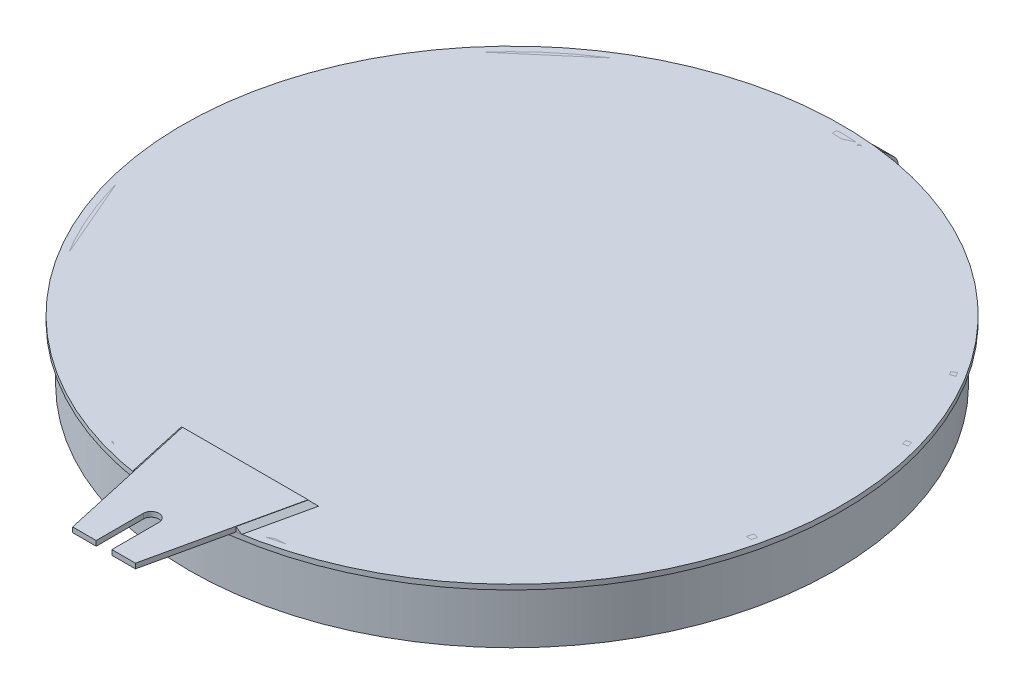
ISO-10303-21;
HEADER;
FILE_DESCRIPTION(('STEP AP214'),'2;1');
FILE_NAME('part.step','',(''),(''),'','','');
FILE_SCHEMA(('AUTOMOTIVE_DESIGN { 1 0 10303 214 1 1 1 1 }'));
ENDSEC;
DATA;
#1=APPLICATION_CONTEXT('core data for automotive mechanical design processes');
#2=APPLICATION_PROTOCOL_DEFINITION('international standard','automotive_design',2000,#1);
#3=PRODUCT_CONTEXT('',#1,'mechanical');
#4=PRODUCT('Part','Part','',(#3));
#5=PRODUCT_RELATED_PRODUCT_CATEGORY('part','',(#4));
#6=PRODUCT_DEFINITION_FORMATION('','',#4);
#7=PRODUCT_DEFINITION_CONTEXT('part definition',#1,'design');
#8=PRODUCT_DEFINITION('design','',#6,#7);
#9=PRODUCT_DEFINITION_SHAPE('','',#8);
#10=(LENGTH_UNIT() NAMED_UNIT(*) SI_UNIT(.MILLI.,.METRE.));
#11=(NAMED_UNIT(*) PLANE_ANGLE_UNIT() SI_UNIT($,.RADIAN.));
#12=(NAMED_UNIT(*) SI_UNIT($,.STERADIAN.) SOLID_ANGLE_UNIT());
#13=UNCERTAINTY_MEASURE_WITH_UNIT(LENGTH_MEASURE(1.E-05),#10,'distance_accuracy_value','');
#14=(GEOMETRIC_REPRESENTATION_CONTEXT(3) GLOBAL_UNCERTAINTY_ASSIGNED_CONTEXT((#13)) GLOBAL_UNIT_ASSIGNED_CONTEXT((#10,
#11,#12)) REPRESENTATION_CONTEXT('',''));
#15=CARTESIAN_POINT('',(0.,0.,0.));
#16=DIRECTION('',(0.,0.,1.));
#17=DIRECTION('',(1.,0.,0.));
#18=AXIS2_PLACEMENT_3D('',#15,#16,#17);
#19=CARTESIAN_POINT('',(-1.52351851851846,38.1,-205.669357261415));
#20=DIRECTION('',(0.999972564781405,0.,-0.00740740740741096));
#21=DIRECTION('',(-0.00740740740741096,0.,-0.999972564781405));
#22=AXIS2_PLACEMENT_3D('',#19,#20,#21);
#23=PLANE('',#22);
#24=DIRECTION('',(0.00740740740741096,0.,0.999972564781405));
#25=VECTOR('',#24,1.);
#26=CARTESIAN_POINT('',(-1.52351851851846,34.925,-205.669357261415));
#27=LINE('',#26,#25);
#28=CARTESIAN_POINT('',(-1.54574074074069,34.925,-208.66927495576));
#29=VERTEX_POINT('',#28);
#30=CARTESIAN_POINT('',(-1.52351851851846,34.925,-205.669357261415));
#31=VERTEX_POINT('',#30);
#32=EDGE_CURVE('E71',#29,#31,#27,.T.);
#33=ORIENTED_EDGE('',*,*,#32,.T.);
#34=DIRECTION('',(0.,-1.,0.));
#35=VECTOR('',#34,1.);
#36=CARTESIAN_POINT('',(-1.52351851851846,34.925,-205.669357261415));
#37=LINE('',#36,#35);
#38=CARTESIAN_POINT('',(-1.52351851851846,31.925,-205.669357261415));
#39=VERTEX_POINT('',#38);
#40=EDGE_CURVE('E97',#31,#39,#37,.T.);
#41=ORIENTED_EDGE('',*,*,#40,.T.);
#42=DIRECTION('',(-0.00523782800879175,0.707106781186548,-0.707087381557436));
#43=VECTOR('',#42,1.);
#44=CARTESIAN_POINT('',(7.88843858002999E-13,-173.75,0.));
#45=LINE('',#44,#43);
#46=EDGE_CURVE('E64',#39,#29,#45,.T.);
#47=ORIENTED_EDGE('',*,*,#46,.T.);
#48=EDGE_LOOP('',(#33,#41,#47));
#49=FACE_BOUND('',#48,.T.);
#50=ADVANCED_FACE('F55',(#49),#23,.T.);
#51=CARTESIAN_POINT('',(1.50000000000007,38.1,-202.494444368234));
#52=DIRECTION('',(-0.999972564781405,0.,-0.00740740740740379));
#53=DIRECTION('',(-0.00740740740740379,0.,0.999972564781405));
#54=AXIS2_PLACEMENT_3D('',#51,#52,#53);
#55=PLANE('',#54);
#56=DIRECTION('',(-0.00523782800878668,-0.707106781186548,0.707087381557436));
#57=VECTOR('',#56,1.);
#58=CARTESIAN_POINT('',(8.02721265070671E-13,-173.75,0.));
#59=LINE('',#58,#57);
#60=CARTESIAN_POINT('',(1.54574074074079,34.925,-208.66927495576));
#61=VERTEX_POINT('',#60);
#62=CARTESIAN_POINT('',(1.52351851851858,31.925,-205.669357261415));
#63=VERTEX_POINT('',#62);
#64=EDGE_CURVE('E12',#61,#63,#59,.T.);
#65=ORIENTED_EDGE('',*,*,#64,.T.);
#66=DIRECTION('',(0.,-1.,0.));
#67=VECTOR('',#66,1.);
#68=CARTESIAN_POINT('',(1.52351851851858,34.925,-205.669357261415));
#69=LINE('',#68,#67);
#70=CARTESIAN_POINT('',(1.52351851851858,34.925,-205.669357261415));
#71=VERTEX_POINT('',#70);
#72=EDGE_CURVE('E95',#71,#63,#69,.T.);
#73=ORIENTED_EDGE('',*,*,#72,.F.);
#74=DIRECTION('',(-0.00740740740740379,0.,0.999972564781405));
#75=VECTOR('',#74,1.);
#76=CARTESIAN_POINT('',(8.02721265070671E-13,34.925,0.));
#77=LINE('',#76,#75);
#78=EDGE_CURVE('E93',#61,#71,#77,.T.);
#79=ORIENTED_EDGE('',*,*,#78,.F.);
#80=EDGE_LOOP('',(#65,#73,#79));
#81=FACE_BOUND('',#80,.T.);
#82=ADVANCED_FACE('F112',(#81),#55,.T.);
#83=CARTESIAN_POINT('',(0.,31.925,0.));
#84=DIRECTION('',(0.,1.,0.));
#85=DIRECTION('',(0.,0.,1.));
#86=AXIS2_PLACEMENT_3D('',#83,#84,#85);
#87=CONICAL_SURFACE('',#86,205.675,0.785398163397448);
#88=ORIENTED_EDGE('',*,*,#64,.F.);
#89=CARTESIAN_POINT('',(0.,34.925,0.));
#90=DIRECTION('',(0.,1.,0.));
#91=DIRECTION('',(0.,0.,1.));
#92=AXIS2_PLACEMENT_3D('',#89,#90,#91);
#93=CIRCLE('',#92,208.675);
#94=EDGE_CURVE('E108',#29,#61,#93,.T.);
#95=ORIENTED_EDGE('',*,*,#94,.F.);
#96=ORIENTED_EDGE('',*,*,#46,.F.);
#97=CARTESIAN_POINT('',(0.,31.925,0.));
#98=DIRECTION('',(0.,1.,0.));
#99=DIRECTION('',(0.,0.,1.));
#100=AXIS2_PLACEMENT_3D('',#97,#98,#99);
#101=CIRCLE('',#100,205.675);
#102=EDGE_CURVE('E79',#63,#39,#101,.F.);
#103=ORIENTED_EDGE('',*,*,#102,.F.);
#104=EDGE_LOOP('',(#88,#95,#96,#103));
#105=FACE_BOUND('',#104,.T.);
#106=ADVANCED_FACE('F58',(#105),#87,.T.);
#107=CARTESIAN_POINT('',(0.,38.1,0.));
#108=DIRECTION('',(0.,-1.,0.));
#109=DIRECTION('',(0.,0.,-1.));
#110=AXIS2_PLACEMENT_3D('',#107,#108,#109);
#111=CYLINDRICAL_SURFACE('',#110,205.675);
#112=ORIENTED_EDGE('',*,*,#102,.T.);
#113=ORIENTED_EDGE('',*,*,#40,.F.);
#114=CARTESIAN_POINT('',(0.,34.925,0.));
#115=DIRECTION('',(0.,1.,0.));
#116=DIRECTION('',(0.,0.,1.));
#117=AXIS2_PLACEMENT_3D('',#114,#115,#116);
#118=CIRCLE('',#117,205.675);
#119=EDGE_CURVE('E90',#71,#31,#118,.F.);
#120=ORIENTED_EDGE('',*,*,#119,.F.);
#121=ORIENTED_EDGE('',*,*,#72,.T.);
#122=EDGE_LOOP('',(#112,#113,#120,#121));
#123=FACE_BOUND('',#122,.T.);
#124=ADVANCED_FACE('F98',(#123),#111,.F.);
#125=CARTESIAN_POINT('',(0.,34.925,0.));
#126=DIRECTION('',(0.,1.,0.));
#127=DIRECTION('',(0.,0.,1.));
#128=AXIS2_PLACEMENT_3D('',#125,#126,#127);
#129=PLANE('',#128);
#130=ORIENTED_EDGE('',*,*,#94,.T.);
#131=ORIENTED_EDGE('',*,*,#78,.T.);
#132=ORIENTED_EDGE('',*,*,#119,.T.);
#133=ORIENTED_EDGE('',*,*,#32,.F.);
#134=EDGE_LOOP('',(#130,#131,#132,#133));
#135=FACE_BOUND('',#134,.T.);
#136=ADVANCED_FACE('F91',(#135),#129,.T.);
#137=CLOSED_SHELL('',(#50,#82,#106,#124,#136));
#138=MANIFOLD_SOLID_BREP('B2',#137);
#139=CARTESIAN_POINT('',(0.,34.925,0.));
#140=DIRECTION('',(0.,1.,0.));
#141=DIRECTION('',(0.,0.,1.));
#142=AXIS2_PLACEMENT_3D('',#139,#140,#141);
#143=CYLINDRICAL_SURFACE('',#142,210.);
#144=CARTESIAN_POINT('',(0.,38.1,0.));
#145=DIRECTION('',(0.,1.,0.));
#146=DIRECTION('',(0.,0.,1.));
#147=AXIS2_PLACEMENT_3D('',#144,#145,#146);
#148=CIRCLE('',#147,210.);
#149=CARTESIAN_POINT('',(-34.830660417037,38.1,207.091344809273));
#150=VERTEX_POINT('',#149);
#151=CARTESIAN_POINT('',(-31.6439629611325,38.1,207.602166674904));
#152=VERTEX_POINT('',#151);
#153=EDGE_CURVE('E199',#150,#152,#148,.T.);
#154=ORIENTED_EDGE('',*,*,#153,.T.);
#155=DIRECTION('',(0.,1.,0.));
#156=VECTOR('',#155,1.);
#157=CARTESIAN_POINT('',(-31.6439629611325,41.1,207.602166674904));
#158=LINE('',#157,#156);
#159=CARTESIAN_POINT('',(-31.6439629611325,41.1,207.602166674904));
#160=VERTEX_POINT('',#159);
#161=EDGE_CURVE('E263',#160,#152,#158,.F.);
#162=ORIENTED_EDGE('',*,*,#161,.F.);
#163=CARTESIAN_POINT('',(0.,117.02566023653,0.));
#164=DIRECTION('',(0.690268489962633,-0.707106781186548,-0.153392997769474));
#165=DIRECTION('',(0.690268489962633,0.707106781186548,-0.153392997769474));
#166=AXIS2_PLACEMENT_3D('',#163,#164,#165);
#167=ELLIPSE('',#166,296.98484809835,210.);
#168=EDGE_CURVE('E191',#160,#150,#167,.T.);
#169=ORIENTED_EDGE('',*,*,#168,.T.);
#170=EDGE_LOOP('',(#154,#162,#169));
#171=FACE_BOUND('',#170,.T.);
#172=ADVANCED_FACE('F181',(#171),#143,.T.);
#173=CARTESIAN_POINT('',(31.6439629611325,38.1,207.602166674904));
#174=VERTEX_POINT('',#173);
#175=CARTESIAN_POINT('',(34.8306604170371,38.1,207.091344809273));
#176=VERTEX_POINT('',#175);
#177=EDGE_CURVE('E253',#174,#176,#148,.T.);
#178=ORIENTED_EDGE('',*,*,#177,.T.);
#179=CARTESIAN_POINT('',(0.,117.025660236529,0.));
#180=DIRECTION('',(-0.690268489962632,-0.707106781186549,-0.153392997769474));
#181=DIRECTION('',(-0.690268489962635,0.707106781186546,-0.153392997769474));
#182=AXIS2_PLACEMENT_3D('',#179,#180,#181);
#183=ELLIPSE('',#182,296.984848098349,210.);
#184=CARTESIAN_POINT('',(31.6439629611325,41.1,207.602166674904));
#185=VERTEX_POINT('',#184);
#186=EDGE_CURVE('E53',#176,#185,#183,.T.);
#187=ORIENTED_EDGE('',*,*,#186,.T.);
#188=DIRECTION('',(0.,1.,0.));
#189=VECTOR('',#188,1.);
#190=CARTESIAN_POINT('',(31.6439629611325,38.1,207.602166674904));
#191=LINE('',#190,#189);
#192=EDGE_CURVE('E207',#174,#185,#191,.T.);
#193=ORIENTED_EDGE('',*,*,#192,.F.);
#194=EDGE_LOOP('',(#178,#187,#193));
#195=FACE_BOUND('',#194,.T.);
#196=ADVANCED_FACE('F291',(#195),#143,.T.);
#197=CARTESIAN_POINT('',(40.,41.1,170.));
#198=DIRECTION('',(-0.690268489962632,-0.707106781186549,-0.153392997769474));
#199=DIRECTION('',(0.216930457818656,0.,-0.976187060183953));
#200=AXIS2_PLACEMENT_3D('',#197,#198,#199);
#201=PLANE('',#200);
#202=ORIENTED_EDGE('',*,*,#186,.F.);
#203=DIRECTION('',(-0.216930457818656,0.,0.976187060183953));
#204=VECTOR('',#203,1.);
#205=CARTESIAN_POINT('',(77.0462082393754,38.1,17.1213796087501));
#206=LINE('',#205,#204);
#207=CARTESIAN_POINT('',(43.739848152431,38.1,167.));
#208=VERTEX_POINT('',#207);
#209=EDGE_CURVE('E267',#208,#176,#206,.T.);
#210=ORIENTED_EDGE('',*,*,#209,.F.);
#211=DIRECTION('',(-0.661257866029185,0.5304422846147,0.530442284614703));
#212=VECTOR('',#211,1.);
#213=CARTESIAN_POINT('',(40.,41.1,170.));
#214=LINE('',#213,#212);
#215=CARTESIAN_POINT('',(40.,41.1,170.));
#216=VERTEX_POINT('',#215);
#217=EDGE_CURVE('E186',#216,#208,#214,.F.);
#218=ORIENTED_EDGE('',*,*,#217,.F.);
#219=DIRECTION('',(0.216930457818656,0.,-0.976187060183953));
#220=VECTOR('',#219,1.);
#221=CARTESIAN_POINT('',(40.,41.1,170.));
#222=LINE('',#221,#220);
#223=EDGE_CURVE('E241',#185,#216,#222,.T.);
#224=ORIENTED_EDGE('',*,*,#223,.F.);
#225=EDGE_LOOP('',(#202,#210,#218,#224));
#226=FACE_BOUND('',#225,.T.);
#227=ADVANCED_FACE('F184',(#226),#201,.F.);
#228=CARTESIAN_POINT('',(-40.,41.1,170.));
#229=DIRECTION('',(0.,-0.707106781186549,0.707106781186546));
#230=DIRECTION('',(-1.,0.,0.));
#231=AXIS2_PLACEMENT_3D('',#228,#229,#230);
#232=PLANE('',#231);
#233=ORIENTED_EDGE('',*,*,#217,.T.);
#234=DIRECTION('',(1.,0.,0.));
#235=VECTOR('',#234,1.);
#236=CARTESIAN_POINT('',(0.,38.1,167.));
#237=LINE('',#236,#235);
#238=CARTESIAN_POINT('',(-43.7398481524309,38.1,167.));
#239=VERTEX_POINT('',#238);
#240=EDGE_CURVE('E269',#239,#208,#237,.T.);
#241=ORIENTED_EDGE('',*,*,#240,.F.);
#242=DIRECTION('',(0.661257866029184,0.530442284614701,0.530442284614704));
#243=VECTOR('',#242,1.);
#244=CARTESIAN_POINT('',(-40.,41.1,170.));
#245=LINE('',#244,#243);
#246=CARTESIAN_POINT('',(-40.,41.1,170.));
#247=VERTEX_POINT('',#246);
#248=EDGE_CURVE('E261',#247,#239,#245,.F.);
#249=ORIENTED_EDGE('',*,*,#248,.F.);
#250=DIRECTION('',(-1.,0.,0.));
#251=VECTOR('',#250,1.);
#252=CARTESIAN_POINT('',(-40.,41.1,170.));
#253=LINE('',#252,#251);
#254=EDGE_CURVE('E273',#216,#247,#253,.T.);
#255=ORIENTED_EDGE('',*,*,#254,.F.);
#256=EDGE_LOOP('',(#233,#241,#249,#255));
#257=FACE_BOUND('',#256,.T.);
#258=ADVANCED_FACE('F286',(#257),#232,.F.);
#259=CARTESIAN_POINT('',(-40.,41.1,170.));
#260=DIRECTION('',(0.690268489962633,-0.707106781186548,-0.153392997769474));
#261=DIRECTION('',(0.216930457818656,0.,0.976187060183953));
#262=AXIS2_PLACEMENT_3D('',#259,#260,#261);
#263=PLANE('',#262);
#264=ORIENTED_EDGE('',*,*,#248,.T.);
#265=DIRECTION('',(-0.216930457818656,0.,-0.976187060183953));
#266=VECTOR('',#265,1.);
#267=CARTESIAN_POINT('',(-77.0462082393754,38.1,17.1213796087501));
#268=LINE('',#267,#266);
#269=EDGE_CURVE('E271',#150,#239,#268,.T.);
#270=ORIENTED_EDGE('',*,*,#269,.F.);
#271=ORIENTED_EDGE('',*,*,#168,.F.);
#272=DIRECTION('',(0.216930457818656,0.,0.976187060183953));
#273=VECTOR('',#272,1.);
#274=CARTESIAN_POINT('',(-40.,41.1,170.));
#275=LINE('',#274,#273);
#276=EDGE_CURVE('E265',#247,#160,#275,.T.);
#277=ORIENTED_EDGE('',*,*,#276,.F.);
#278=EDGE_LOOP('',(#264,#270,#271,#277));
#279=FACE_BOUND('',#278,.T.);
#280=ADVANCED_FACE('F303',(#279),#263,.F.);
#281=CARTESIAN_POINT('',(-40.,41.275,170.));
#282=DIRECTION('',(0.,0.,1.));
#283=DIRECTION('',(1.,0.,0.));
#284=AXIS2_PLACEMENT_3D('',#281,#282,#283);
#285=PLANE('',#284);
#286=ORIENTED_EDGE('',*,*,#254,.T.);
#287=DIRECTION('',(0.,-1.,0.));
#288=VECTOR('',#287,1.);
#289=CARTESIAN_POINT('',(-40.,41.275,170.));
#290=LINE('',#289,#288);
#291=CARTESIAN_POINT('',(-40.,38.1,170.));
#292=VERTEX_POINT('',#291);
#293=EDGE_CURVE('E246',#247,#292,#290,.T.);
#294=ORIENTED_EDGE('',*,*,#293,.T.);
#295=DIRECTION('',(-1.,0.,0.));
#296=VECTOR('',#295,1.);
#297=CARTESIAN_POINT('',(-40.,38.1,170.));
#298=LINE('',#297,#296);
#299=CARTESIAN_POINT('',(40.,38.1,170.));
#300=VERTEX_POINT('',#299);
#301=EDGE_CURVE('E250',#300,#292,#298,.T.);
#302=ORIENTED_EDGE('',*,*,#301,.F.);
#303=DIRECTION('',(0.,-1.,0.));
#304=VECTOR('',#303,1.);
#305=CARTESIAN_POINT('',(40.,41.275,170.));
#306=LINE('',#305,#304);
#307=EDGE_CURVE('E236',#216,#300,#306,.T.);
#308=ORIENTED_EDGE('',*,*,#307,.F.);
#309=EDGE_LOOP('',(#286,#294,#302,#308));
#310=FACE_BOUND('',#309,.T.);
#311=ADVANCED_FACE('F255',(#310),#285,.T.);
#312=CARTESIAN_POINT('',(0.,38.1,0.));
#313=DIRECTION('',(0.,1.,0.));
#314=DIRECTION('',(0.,0.,1.));
#315=AXIS2_PLACEMENT_3D('',#312,#313,#314);
#316=PLANE('',#315);
#317=ORIENTED_EDGE('',*,*,#177,.F.);
#318=DIRECTION('',(0.216930457818656,0.,-0.976187060183953));
#319=VECTOR('',#318,1.);
#320=CARTESIAN_POINT('',(40.,38.1,170.));
#321=LINE('',#320,#319);
#322=EDGE_CURVE('E239',#174,#300,#321,.T.);
#323=ORIENTED_EDGE('',*,*,#322,.T.);
#324=ORIENTED_EDGE('',*,*,#301,.T.);
#325=DIRECTION('',(0.216930457818656,0.,0.976187060183953));
#326=VECTOR('',#325,1.);
#327=CARTESIAN_POINT('',(-40.,38.1,170.));
#328=LINE('',#327,#326);
#329=EDGE_CURVE('E245',#292,#152,#328,.T.);
#330=ORIENTED_EDGE('',*,*,#329,.T.);
#331=ORIENTED_EDGE('',*,*,#153,.F.);
#332=ORIENTED_EDGE('',*,*,#269,.T.);
#333=ORIENTED_EDGE('',*,*,#240,.T.);
#334=ORIENTED_EDGE('',*,*,#209,.T.);
#335=EDGE_LOOP('',(#317,#323,#324,#330,#331,#332,#333,#334));
#336=FACE_BOUND('',#335,.T.);
#337=ADVANCED_FACE('F249',(#336),#316,.F.);
#338=CARTESIAN_POINT('',(40.,41.275,170.));
#339=DIRECTION('',(-0.976187060183953,0.,-0.216930457818656));
#340=DIRECTION('',(-0.216930457818656,0.,0.976187060183953));
#341=AXIS2_PLACEMENT_3D('',#338,#339,#340);
#342=PLANE('',#341);
#343=ORIENTED_EDGE('',*,*,#223,.T.);
#344=ORIENTED_EDGE('',*,*,#307,.T.);
#345=ORIENTED_EDGE('',*,*,#322,.F.);
#346=ORIENTED_EDGE('',*,*,#192,.T.);
#347=EDGE_LOOP('',(#343,#344,#345,#346));
#348=FACE_BOUND('',#347,.T.);
#349=ADVANCED_FACE('F238',(#348),#342,.T.);
#350=CARTESIAN_POINT('',(-40.,41.275,170.));
#351=DIRECTION('',(0.976187060183953,0.,-0.216930457818656));
#352=DIRECTION('',(-0.216930457818656,0.,-0.976187060183953));
#353=AXIS2_PLACEMENT_3D('',#350,#351,#352);
#354=PLANE('',#353);
#355=ORIENTED_EDGE('',*,*,#329,.F.);
#356=ORIENTED_EDGE('',*,*,#293,.F.);
#357=ORIENTED_EDGE('',*,*,#276,.T.);
#358=ORIENTED_EDGE('',*,*,#161,.T.);
#359=EDGE_LOOP('',(#355,#356,#357,#358));
#360=FACE_BOUND('',#359,.T.);
#361=ADVANCED_FACE('F336',(#360),#354,.T.);
#362=CLOSED_SHELL('',(#172,#196,#227,#258,#280,#311,#337,#349,#361));
#363=MANIFOLD_SOLID_BREP('B6',#362);
#364=CARTESIAN_POINT('',(40.,41.275,170.));
#365=DIRECTION('',(-0.976187060183953,0.,-0.216930457818656));
#366=DIRECTION('',(-0.216930457818656,0.,0.976187060183953));
#367=AXIS2_PLACEMENT_3D('',#364,#365,#366);
#368=PLANE('',#367);
#369=DIRECTION('',(0.216930457818656,0.,-0.976187060183953));
#370=VECTOR('',#369,1.);
#371=CARTESIAN_POINT('',(40.,38.1,170.));
#372=LINE('',#371,#370);
#373=CARTESIAN_POINT('',(20.,38.1,260.));
#374=VERTEX_POINT('',#373);
#375=CARTESIAN_POINT('',(40.,38.1,170.));
#376=VERTEX_POINT('',#375);
#377=EDGE_CURVE('E509',#374,#376,#372,.T.);
#378=ORIENTED_EDGE('',*,*,#377,.T.);
#379=DIRECTION('',(0.,-1.,0.));
#380=VECTOR('',#379,1.);
#381=CARTESIAN_POINT('',(40.,41.275,170.));
#382=LINE('',#381,#380);
#383=CARTESIAN_POINT('',(40.,41.275,170.));
#384=VERTEX_POINT('',#383);
#385=EDGE_CURVE('E179',#384,#376,#382,.T.);
#386=ORIENTED_EDGE('',*,*,#385,.F.);
#387=DIRECTION('',(0.216930457818656,0.,-0.976187060183953));
#388=VECTOR('',#387,1.);
#389=CARTESIAN_POINT('',(40.,41.275,170.));
#390=LINE('',#389,#388);
#391=CARTESIAN_POINT('',(20.,41.275,260.));
#392=VERTEX_POINT('',#391);
#393=EDGE_CURVE('E523',#392,#384,#390,.T.);
#394=ORIENTED_EDGE('',*,*,#393,.F.);
#395=DIRECTION('',(0.,-1.,0.));
#396=VECTOR('',#395,1.);
#397=CARTESIAN_POINT('',(20.,41.275,260.));
#398=LINE('',#397,#396);
#399=EDGE_CURVE('E505',#392,#374,#398,.T.);
#400=ORIENTED_EDGE('',*,*,#399,.T.);
#401=EDGE_LOOP('',(#378,#386,#394,#400));
#402=FACE_BOUND('',#401,.T.);
#403=ADVANCED_FACE('F413',(#402),#368,.F.);
#404=CARTESIAN_POINT('',(-40.,41.275,170.));
#405=DIRECTION('',(0.,0.,1.));
#406=DIRECTION('',(1.,0.,0.));
#407=AXIS2_PLACEMENT_3D('',#404,#405,#406);
#408=PLANE('',#407);
#409=DIRECTION('',(-1.,0.,0.));
#410=VECTOR('',#409,1.);
#411=CARTESIAN_POINT('',(-40.,38.1,170.));
#412=LINE('',#411,#410);
#413=CARTESIAN_POINT('',(-40.,38.1,170.));
#414=VERTEX_POINT('',#413);
#415=EDGE_CURVE('E512',#376,#414,#412,.T.);
#416=ORIENTED_EDGE('',*,*,#415,.T.);
#417=DIRECTION('',(0.,-1.,0.));
#418=VECTOR('',#417,1.);
#419=CARTESIAN_POINT('',(-40.,41.275,170.));
#420=LINE('',#419,#418);
#421=CARTESIAN_POINT('',(-40.,41.275,170.));
#422=VERTEX_POINT('',#421);
#423=EDGE_CURVE('E421',#422,#414,#420,.T.);
#424=ORIENTED_EDGE('',*,*,#423,.F.);
#425=DIRECTION('',(-1.,0.,0.));
#426=VECTOR('',#425,1.);
#427=CARTESIAN_POINT('',(-40.,41.275,170.));
#428=LINE('',#427,#426);
#429=EDGE_CURVE('E472',#384,#422,#428,.T.);
#430=ORIENTED_EDGE('',*,*,#429,.F.);
#431=ORIENTED_EDGE('',*,*,#385,.T.);
#432=EDGE_LOOP('',(#416,#424,#430,#431));
#433=FACE_BOUND('',#432,.T.);
#434=ADVANCED_FACE('F558',(#433),#408,.F.);
#435=CARTESIAN_POINT('',(-40.,41.275,170.));
#436=DIRECTION('',(0.976187060183953,0.,-0.216930457818656));
#437=DIRECTION('',(-0.216930457818656,0.,-0.976187060183953));
#438=AXIS2_PLACEMENT_3D('',#435,#436,#437);
#439=PLANE('',#438);
#440=DIRECTION('',(0.216930457818656,0.,0.976187060183953));
#441=VECTOR('',#440,1.);
#442=CARTESIAN_POINT('',(-40.,38.1,170.));
#443=LINE('',#442,#441);
#444=CARTESIAN_POINT('',(-20.,38.1,260.));
#445=VERTEX_POINT('',#444);
#446=EDGE_CURVE('E514',#414,#445,#443,.T.);
#447=ORIENTED_EDGE('',*,*,#446,.T.);
#448=DIRECTION('',(0.,-1.,0.));
#449=VECTOR('',#448,1.);
#450=CARTESIAN_POINT('',(-20.,41.275,260.));
#451=LINE('',#450,#449);
#452=CARTESIAN_POINT('',(-20.,41.275,260.));
#453=VERTEX_POINT('',#452);
#454=EDGE_CURVE('E530',#453,#445,#451,.T.);
#455=ORIENTED_EDGE('',*,*,#454,.F.);
#456=DIRECTION('',(0.216930457818656,0.,0.976187060183953));
#457=VECTOR('',#456,1.);
#458=CARTESIAN_POINT('',(-40.,41.275,170.));
#459=LINE('',#458,#457);
#460=EDGE_CURVE('E538',#422,#453,#459,.T.);
#461=ORIENTED_EDGE('',*,*,#460,.F.);
#462=ORIENTED_EDGE('',*,*,#423,.T.);
#463=EDGE_LOOP('',(#447,#455,#461,#462));
#464=FACE_BOUND('',#463,.T.);
#465=ADVANCED_FACE('F536',(#464),#439,.F.);
#466=CARTESIAN_POINT('',(-20.,41.275,260.));
#467=DIRECTION('',(0.,0.,-1.));
#468=DIRECTION('',(-1.,0.,0.));
#469=AXIS2_PLACEMENT_3D('',#466,#467,#468);
#470=PLANE('',#469);
#471=DIRECTION('',(1.,0.,0.));
#472=VECTOR('',#471,1.);
#473=CARTESIAN_POINT('',(-20.,38.1,260.));
#474=LINE('',#473,#472);
#475=CARTESIAN_POINT('',(-4.99999999999996,38.1,260.));
#476=VERTEX_POINT('',#475);
#477=EDGE_CURVE('E516',#445,#476,#474,.T.);
#478=ORIENTED_EDGE('',*,*,#477,.T.);
#479=DIRECTION('',(0.,-1.,0.));
#480=VECTOR('',#479,1.);
#481=CARTESIAN_POINT('',(-4.99999999999996,41.275,260.));
#482=LINE('',#481,#480);
#483=CARTESIAN_POINT('',(-4.99999999999996,41.275,260.));
#484=VERTEX_POINT('',#483);
#485=EDGE_CURVE('E527',#484,#476,#482,.T.);
#486=ORIENTED_EDGE('',*,*,#485,.F.);
#487=DIRECTION('',(1.,0.,0.));
#488=VECTOR('',#487,1.);
#489=CARTESIAN_POINT('',(-20.,41.275,260.));
#490=LINE('',#489,#488);
#491=EDGE_CURVE('E550',#453,#484,#490,.T.);
#492=ORIENTED_EDGE('',*,*,#491,.F.);
#493=ORIENTED_EDGE('',*,*,#454,.T.);
#494=EDGE_LOOP('',(#478,#486,#492,#493));
#495=FACE_BOUND('',#494,.T.);
#496=ADVANCED_FACE('F546',(#495),#470,.F.);
#497=CARTESIAN_POINT('',(-4.99999999999996,41.275,260.));
#498=DIRECTION('',(-1.,0.,0.));
#499=DIRECTION('',(0.,0.,1.));
#500=AXIS2_PLACEMENT_3D('',#497,#498,#499);
#501=PLANE('',#500);
#502=DIRECTION('',(0.,0.,-1.));
#503=VECTOR('',#502,1.);
#504=CARTESIAN_POINT('',(-4.99999999999996,38.1,260.));
#505=LINE('',#504,#503);
#506=CARTESIAN_POINT('',(-5.,38.1,230.));
#507=VERTEX_POINT('',#506);
#508=EDGE_CURVE('E518',#476,#507,#505,.T.);
#509=ORIENTED_EDGE('',*,*,#508,.T.);
#510=DIRECTION('',(0.,-1.,0.));
#511=VECTOR('',#510,1.);
#512=CARTESIAN_POINT('',(-5.,41.275,230.));
#513=LINE('',#512,#511);
#514=CARTESIAN_POINT('',(-5.,41.275,230.));
#515=VERTEX_POINT('',#514);
#516=EDGE_CURVE('E500',#515,#507,#513,.T.);
#517=ORIENTED_EDGE('',*,*,#516,.F.);
#518=DIRECTION('',(0.,0.,-1.));
#519=VECTOR('',#518,1.);
#520=CARTESIAN_POINT('',(-4.99999999999996,41.275,260.));
#521=LINE('',#520,#519);
#522=EDGE_CURVE('E491',#484,#515,#521,.T.);
#523=ORIENTED_EDGE('',*,*,#522,.F.);
#524=ORIENTED_EDGE('',*,*,#485,.T.);
#525=EDGE_LOOP('',(#509,#517,#523,#524));
#526=FACE_BOUND('',#525,.T.);
#527=ADVANCED_FACE('F549',(#526),#501,.F.);
#528=CARTESIAN_POINT('',(0.,41.275,230.));
#529=DIRECTION('',(0.,-1.,0.));
#530=DIRECTION('',(0.,0.,-1.));
#531=AXIS2_PLACEMENT_3D('',#528,#529,#530);
#532=CYLINDRICAL_SURFACE('',#531,5.);
#533=CARTESIAN_POINT('',(0.,38.1,230.));
#534=DIRECTION('',(0.,-1.,0.));
#535=DIRECTION('',(0.,0.,-1.));
#536=AXIS2_PLACEMENT_3D('',#533,#534,#535);
#537=CIRCLE('',#536,5.);
#538=CARTESIAN_POINT('',(5.00000000000003,38.1,230.));
#539=VERTEX_POINT('',#538);
#540=EDGE_CURVE('E499',#507,#539,#537,.T.);
#541=ORIENTED_EDGE('',*,*,#540,.T.);
#542=DIRECTION('',(0.,-1.,0.));
#543=VECTOR('',#542,1.);
#544=CARTESIAN_POINT('',(5.00000000000003,41.275,230.));
#545=LINE('',#544,#543);
#546=CARTESIAN_POINT('',(5.00000000000003,41.275,230.));
#547=VERTEX_POINT('',#546);
#548=EDGE_CURVE('E496',#547,#539,#545,.T.);
#549=ORIENTED_EDGE('',*,*,#548,.F.);
#550=CARTESIAN_POINT('',(0.,41.275,230.));
#551=DIRECTION('',(0.,-1.,0.));
#552=DIRECTION('',(0.,0.,-1.));
#553=AXIS2_PLACEMENT_3D('',#550,#551,#552);
#554=CIRCLE('',#553,5.);
#555=EDGE_CURVE('E485',#515,#547,#554,.T.);
#556=ORIENTED_EDGE('',*,*,#555,.F.);
#557=ORIENTED_EDGE('',*,*,#516,.T.);
#558=EDGE_LOOP('',(#541,#549,#556,#557));
#559=FACE_BOUND('',#558,.T.);
#560=ADVANCED_FACE('F497',(#559),#532,.F.);
#561=CARTESIAN_POINT('',(5.00000000000003,41.275,260.));
#562=DIRECTION('',(1.,0.,0.));
#563=DIRECTION('',(0.,0.,-1.));
#564=AXIS2_PLACEMENT_3D('',#561,#562,#563);
#565=PLANE('',#564);
#566=DIRECTION('',(0.,0.,1.));
#567=VECTOR('',#566,1.);
#568=CARTESIAN_POINT('',(5.00000000000003,38.1,260.));
#569=LINE('',#568,#567);
#570=CARTESIAN_POINT('',(5.00000000000003,38.1,260.));
#571=VERTEX_POINT('',#570);
#572=EDGE_CURVE('E458',#539,#571,#569,.T.);
#573=ORIENTED_EDGE('',*,*,#572,.T.);
#574=DIRECTION('',(0.,-1.,0.));
#575=VECTOR('',#574,1.);
#576=CARTESIAN_POINT('',(5.00000000000003,41.275,260.));
#577=LINE('',#576,#575);
#578=CARTESIAN_POINT('',(5.00000000000003,41.275,260.));
#579=VERTEX_POINT('',#578);
#580=EDGE_CURVE('E501',#579,#571,#577,.T.);
#581=ORIENTED_EDGE('',*,*,#580,.F.);
#582=DIRECTION('',(0.,0.,1.));
#583=VECTOR('',#582,1.);
#584=CARTESIAN_POINT('',(5.00000000000003,41.275,260.));
#585=LINE('',#584,#583);
#586=EDGE_CURVE('E489',#547,#579,#585,.T.);
#587=ORIENTED_EDGE('',*,*,#586,.F.);
#588=ORIENTED_EDGE('',*,*,#548,.T.);
#589=EDGE_LOOP('',(#573,#581,#587,#588));
#590=FACE_BOUND('',#589,.T.);
#591=ADVANCED_FACE('F503',(#590),#565,.F.);
#592=CARTESIAN_POINT('',(20.,41.275,260.));
#593=DIRECTION('',(0.,0.,-1.));
#594=DIRECTION('',(-1.,0.,0.));
#595=AXIS2_PLACEMENT_3D('',#592,#593,#594);
#596=PLANE('',#595);
#597=DIRECTION('',(1.,0.,0.));
#598=VECTOR('',#597,1.);
#599=CARTESIAN_POINT('',(20.,38.1,260.));
#600=LINE('',#599,#598);
#601=EDGE_CURVE('E464',#571,#374,#600,.T.);
#602=ORIENTED_EDGE('',*,*,#601,.T.);
#603=ORIENTED_EDGE('',*,*,#399,.F.);
#604=DIRECTION('',(1.,0.,0.));
#605=VECTOR('',#604,1.);
#606=CARTESIAN_POINT('',(20.,41.275,260.));
#607=LINE('',#606,#605);
#608=EDGE_CURVE('E429',#579,#392,#607,.T.);
#609=ORIENTED_EDGE('',*,*,#608,.F.);
#610=ORIENTED_EDGE('',*,*,#580,.T.);
#611=EDGE_LOOP('',(#602,#603,#609,#610));
#612=FACE_BOUND('',#611,.T.);
#613=ADVANCED_FACE('F574',(#612),#596,.F.);
#614=CARTESIAN_POINT('',(0.,41.275,230.));
#615=DIRECTION('',(0.,-1.,0.));
#616=DIRECTION('',(0.,0.,-1.));
#617=AXIS2_PLACEMENT_3D('',#614,#615,#616);
#618=PLANE('',#617);
#619=ORIENTED_EDGE('',*,*,#393,.T.);
#620=ORIENTED_EDGE('',*,*,#429,.T.);
#621=ORIENTED_EDGE('',*,*,#460,.T.);
#622=ORIENTED_EDGE('',*,*,#491,.T.);
#623=ORIENTED_EDGE('',*,*,#522,.T.);
#624=ORIENTED_EDGE('',*,*,#555,.T.);
#625=ORIENTED_EDGE('',*,*,#586,.T.);
#626=ORIENTED_EDGE('',*,*,#608,.T.);
#627=EDGE_LOOP('',(#619,#620,#621,#622,#623,#624,#625,#626));
#628=FACE_BOUND('',#627,.T.);
#629=ADVANCED_FACE('F487',(#628),#618,.F.);
#630=CARTESIAN_POINT('',(0.,38.1,230.));
#631=DIRECTION('',(0.,-1.,0.));
#632=DIRECTION('',(0.,0.,-1.));
#633=AXIS2_PLACEMENT_3D('',#630,#631,#632);
#634=PLANE('',#633);
#635=ORIENTED_EDGE('',*,*,#377,.F.);
#636=ORIENTED_EDGE('',*,*,#601,.F.);
#637=ORIENTED_EDGE('',*,*,#572,.F.);
#638=ORIENTED_EDGE('',*,*,#540,.F.);
#639=ORIENTED_EDGE('',*,*,#508,.F.);
#640=ORIENTED_EDGE('',*,*,#477,.F.);
#641=ORIENTED_EDGE('',*,*,#446,.F.);
#642=ORIENTED_EDGE('',*,*,#415,.F.);
#643=EDGE_LOOP('',(#635,#636,#637,#638,#639,#640,#641,#642));
#644=FACE_BOUND('',#643,.T.);
#645=ADVANCED_FACE('F542',(#644),#634,.T.);
#646=CLOSED_SHELL('',(#403,#434,#465,#496,#527,#560,#591,#613,#629,#645));
#647=MANIFOLD_SOLID_BREP('B47',#646);
#648=CARTESIAN_POINT('',(0.,34.925,0.));
#649=DIRECTION('',(0.,1.,0.));
#650=DIRECTION('',(0.,0.,1.));
#651=AXIS2_PLACEMENT_3D('',#648,#649,#650);
#652=CYLINDRICAL_SURFACE('',#651,210.);
#653=CARTESIAN_POINT('',(0.,34.925,0.));
#654=DIRECTION('',(0.,1.,0.));
#655=DIRECTION('',(0.,0.,1.));
#656=AXIS2_PLACEMENT_3D('',#653,#654,#655);
#657=CIRCLE('',#656,210.);
#658=CARTESIAN_POINT('',(0.,34.925,210.));
#659=VERTEX_POINT('',#658);
#660=EDGE_CURVE('E412',#659,#659,#657,.T.);
#661=ORIENTED_EDGE('',*,*,#660,.T.);
#662=EDGE_LOOP('',(#661));
#663=FACE_BOUND('',#662,.T.);
#664=CARTESIAN_POINT('',(0.,38.1,0.));
#665=DIRECTION('',(0.,1.,0.));
#666=DIRECTION('',(0.,0.,1.));
#667=AXIS2_PLACEMENT_3D('',#664,#665,#666);
#668=CIRCLE('',#667,210.);
#669=CARTESIAN_POINT('',(0.,38.1,210.));
#670=VERTEX_POINT('',#669);
#671=EDGE_CURVE('E693',#670,#670,#668,.T.);
#672=ORIENTED_EDGE('',*,*,#671,.F.);
#673=EDGE_LOOP('',(#672));
#674=FACE_BOUND('',#673,.T.);
#675=ADVANCED_FACE('F690',(#663,#674),#652,.T.);
#676=CARTESIAN_POINT('',(0.,34.925,0.));
#677=DIRECTION('',(0.,1.,0.));
#678=DIRECTION('',(0.,0.,1.));
#679=AXIS2_PLACEMENT_3D('',#676,#677,#678);
#680=PLANE('',#679);
#681=ORIENTED_EDGE('',*,*,#660,.F.);
#682=EDGE_LOOP('',(#681));
#683=FACE_BOUND('',#682,.T.);
#684=ADVANCED_FACE('F705',(#683),#680,.F.);
#685=CARTESIAN_POINT('',(0.,38.1,0.));
#686=DIRECTION('',(0.,1.,0.));
#687=DIRECTION('',(0.,0.,1.));
#688=AXIS2_PLACEMENT_3D('',#685,#686,#687);
#689=PLANE('',#688);
#690=ORIENTED_EDGE('',*,*,#671,.T.);
#691=EDGE_LOOP('',(#690));
#692=FACE_BOUND('',#691,.T.);
#693=ADVANCED_FACE('F702',(#692),#689,.T.);
#694=CLOSED_SHELL('',(#675,#684,#693));
#695=MANIFOLD_SOLID_BREP('B173',#694);
#696=CARTESIAN_POINT('',(6.,3.1,-230.669357261415));
#697=DIRECTION('',(1.,0.,0.));
#698=DIRECTION('',(0.,0.,-1.));
#699=AXIS2_PLACEMENT_3D('',#696,#697,#698);
#700=PLANE('',#699);
#701=DIRECTION('',(0.,0.664813334651805,0.747009524751289));
#702=VECTOR('',#701,1.);
#703=CARTESIAN_POINT('',(6.,10.215265723256,-237.001704273974));
#704=LINE('',#703,#702);
#705=CARTESIAN_POINT('',(6.,10.215265723256,-237.001704273974));
#706=VERTEX_POINT('',#705);
#707=CARTESIAN_POINT('',(6.,38.1,-205.669357261415));
#708=VERTEX_POINT('',#707);
#709=EDGE_CURVE('E803',#706,#708,#704,.T.);
#710=ORIENTED_EDGE('',*,*,#709,.T.);
#711=DIRECTION('',(0.,-1.,0.));
#712=VECTOR('',#711,1.);
#713=CARTESIAN_POINT('',(6.,38.1,-205.669357261415));
#714=LINE('',#713,#712);
#715=CARTESIAN_POINT('',(6.,0.,-205.669357261415));
#716=VERTEX_POINT('',#715);
#717=EDGE_CURVE('E798',#708,#716,#714,.T.);
#718=ORIENTED_EDGE('',*,*,#717,.T.);
#719=DIRECTION('',(0.,-0.261308332444767,-0.965255383509947));
#720=VECTOR('',#719,1.);
#721=CARTESIAN_POINT('',(6.,0.,-205.669357261415));
#722=LINE('',#721,#720);
#723=CARTESIAN_POINT('',(6.,-6.09405752793226,-228.180395394879));
#724=VERTEX_POINT('',#723);
#725=EDGE_CURVE('E801',#716,#724,#722,.T.);
#726=ORIENTED_EDGE('',*,*,#725,.T.);
#727=CARTESIAN_POINT('',(6.,3.1,-230.669357261415));
#728=DIRECTION('',(1.,0.,0.));
#729=DIRECTION('',(0.,0.,-1.));
#730=AXIS2_PLACEMENT_3D('',#727,#728,#729);
#731=CIRCLE('',#730,9.525);
#732=EDGE_CURVE('E768',#724,#706,#731,.T.);
#733=ORIENTED_EDGE('',*,*,#732,.T.);
#734=EDGE_LOOP('',(#710,#718,#726,#733));
#735=FACE_BOUND('',#734,.T.);
#736=CARTESIAN_POINT('',(6.,3.1,-230.669357261415));
#737=DIRECTION('',(1.,0.,0.));
#738=DIRECTION('',(0.,0.,-1.));
#739=AXIS2_PLACEMENT_3D('',#736,#737,#738);
#740=CIRCLE('',#739,5.00000000000002);
#741=CARTESIAN_POINT('',(6.,3.1,-235.669357261415));
#742=VERTEX_POINT('',#741);
#743=EDGE_CURVE('E818',#742,#742,#740,.T.);
#744=ORIENTED_EDGE('',*,*,#743,.F.);
#745=EDGE_LOOP('',(#744));
#746=FACE_BOUND('',#745,.T.);
#747=ADVANCED_FACE('F751',(#735,#746),#700,.T.);
#748=CARTESIAN_POINT('',(-6.,3.1,-230.669357261415));
#749=DIRECTION('',(1.,0.,0.));
#750=DIRECTION('',(0.,0.,-1.));
#751=AXIS2_PLACEMENT_3D('',#748,#749,#750);
#752=PLANE('',#751);
#753=DIRECTION('',(0.,0.664813334651805,0.747009524751289));
#754=VECTOR('',#753,1.);
#755=CARTESIAN_POINT('',(-6.,10.215265723256,-237.001704273974));
#756=LINE('',#755,#754);
#757=CARTESIAN_POINT('',(-6.,10.215265723256,-237.001704273974));
#758=VERTEX_POINT('',#757);
#759=CARTESIAN_POINT('',(-6.,38.1,-205.669357261415));
#760=VERTEX_POINT('',#759);
#761=EDGE_CURVE('E815',#758,#760,#756,.T.);
#762=ORIENTED_EDGE('',*,*,#761,.F.);
#763=CARTESIAN_POINT('',(-6.,3.1,-230.669357261415));
#764=DIRECTION('',(1.,0.,0.));
#765=DIRECTION('',(0.,0.,-1.));
#766=AXIS2_PLACEMENT_3D('',#763,#764,#765);
#767=CIRCLE('',#766,9.525);
#768=CARTESIAN_POINT('',(-6.,-6.09405752793226,-228.180395394879));
#769=VERTEX_POINT('',#768);
#770=EDGE_CURVE('E791',#769,#758,#767,.T.);
#771=ORIENTED_EDGE('',*,*,#770,.F.);
#772=DIRECTION('',(0.,-0.261308332444767,-0.965255383509947));
#773=VECTOR('',#772,1.);
#774=CARTESIAN_POINT('',(-6.,0.,-205.669357261415));
#775=LINE('',#774,#773);
#776=CARTESIAN_POINT('',(-6.,0.,-205.669357261415));
#777=VERTEX_POINT('',#776);
#778=EDGE_CURVE('E785',#777,#769,#775,.T.);
#779=ORIENTED_EDGE('',*,*,#778,.F.);
#780=DIRECTION('',(0.,-1.,0.));
#781=VECTOR('',#780,1.);
#782=CARTESIAN_POINT('',(-6.,38.1,-205.669357261415));
#783=LINE('',#782,#781);
#784=EDGE_CURVE('E807',#760,#777,#783,.T.);
#785=ORIENTED_EDGE('',*,*,#784,.F.);
#786=EDGE_LOOP('',(#762,#771,#779,#785));
#787=FACE_BOUND('',#786,.T.);
#788=CARTESIAN_POINT('',(-6.,3.1,-230.669357261415));
#789=DIRECTION('',(1.,0.,0.));
#790=DIRECTION('',(0.,0.,-1.));
#791=AXIS2_PLACEMENT_3D('',#788,#789,#790);
#792=CIRCLE('',#791,5.00000000000002);
#793=CARTESIAN_POINT('',(-6.,3.1,-235.669357261415));
#794=VERTEX_POINT('',#793);
#795=EDGE_CURVE('E830',#794,#794,#792,.T.);
#796=ORIENTED_EDGE('',*,*,#795,.T.);
#797=EDGE_LOOP('',(#796));
#798=FACE_BOUND('',#797,.T.);
#799=ADVANCED_FACE('F826',(#787,#798),#752,.F.);
#800=CARTESIAN_POINT('',(6.,10.215265723256,-237.001704273974));
#801=DIRECTION('',(0.,-0.747009524751289,0.664813334651805));
#802=DIRECTION('',(0.,-0.664813334651805,-0.747009524751289));
#803=AXIS2_PLACEMENT_3D('',#800,#801,#802);
#804=PLANE('',#803);
#805=ORIENTED_EDGE('',*,*,#761,.T.);
#806=DIRECTION('',(-1.,0.,0.));
#807=VECTOR('',#806,1.);
#808=CARTESIAN_POINT('',(6.,38.1,-205.669357261415));
#809=LINE('',#808,#807);
#810=EDGE_CURVE('E688',#708,#760,#809,.T.);
#811=ORIENTED_EDGE('',*,*,#810,.F.);
#812=ORIENTED_EDGE('',*,*,#709,.F.);
#813=DIRECTION('',(-1.,0.,0.));
#814=VECTOR('',#813,1.);
#815=CARTESIAN_POINT('',(6.,10.215265723256,-237.001704273974));
#816=LINE('',#815,#814);
#817=EDGE_CURVE('E811',#706,#758,#816,.T.);
#818=ORIENTED_EDGE('',*,*,#817,.T.);
#819=EDGE_LOOP('',(#805,#811,#812,#818));
#820=FACE_BOUND('',#819,.T.);
#821=ADVANCED_FACE('F753',(#820),#804,.F.);
#822=CARTESIAN_POINT('',(6.,38.1,-205.669357261415));
#823=DIRECTION('',(0.,0.,-1.));
#824=DIRECTION('',(-1.,0.,0.));
#825=AXIS2_PLACEMENT_3D('',#822,#823,#824);
#826=PLANE('',#825);
#827=ORIENTED_EDGE('',*,*,#784,.T.);
#828=DIRECTION('',(-1.,0.,0.));
#829=VECTOR('',#828,1.);
#830=CARTESIAN_POINT('',(6.,0.,-205.669357261415));
#831=LINE('',#830,#829);
#832=EDGE_CURVE('E760',#716,#777,#831,.T.);
#833=ORIENTED_EDGE('',*,*,#832,.F.);
#834=ORIENTED_EDGE('',*,*,#717,.F.);
#835=ORIENTED_EDGE('',*,*,#810,.T.);
#836=EDGE_LOOP('',(#827,#833,#834,#835));
#837=FACE_BOUND('',#836,.T.);
#838=ADVANCED_FACE('F806',(#837),#826,.F.);
#839=CARTESIAN_POINT('',(6.,0.,-205.669357261415));
#840=DIRECTION('',(0.,0.965255383509947,-0.261308332444767));
#841=DIRECTION('',(0.,0.261308332444767,0.965255383509947));
#842=AXIS2_PLACEMENT_3D('',#839,#840,#841);
#843=PLANE('',#842);
#844=ORIENTED_EDGE('',*,*,#778,.T.);
#845=DIRECTION('',(-1.,0.,0.));
#846=VECTOR('',#845,1.);
#847=CARTESIAN_POINT('',(6.,-6.09405752793226,-228.180395394879));
#848=LINE('',#847,#846);
#849=EDGE_CURVE('E808',#724,#769,#848,.T.);
#850=ORIENTED_EDGE('',*,*,#849,.F.);
#851=ORIENTED_EDGE('',*,*,#725,.F.);
#852=ORIENTED_EDGE('',*,*,#832,.T.);
#853=EDGE_LOOP('',(#844,#850,#851,#852));
#854=FACE_BOUND('',#853,.T.);
#855=ADVANCED_FACE('F809',(#854),#843,.F.);
#856=CARTESIAN_POINT('',(6.,3.1,-230.669357261415));
#857=DIRECTION('',(-1.,0.,0.));
#858=DIRECTION('',(0.,0.,1.));
#859=AXIS2_PLACEMENT_3D('',#856,#857,#858);
#860=CYLINDRICAL_SURFACE('',#859,9.525);
#861=ORIENTED_EDGE('',*,*,#770,.T.);
#862=ORIENTED_EDGE('',*,*,#817,.F.);
#863=ORIENTED_EDGE('',*,*,#732,.F.);
#864=ORIENTED_EDGE('',*,*,#849,.T.);
#865=EDGE_LOOP('',(#861,#862,#863,#864));
#866=FACE_BOUND('',#865,.T.);
#867=ADVANCED_FACE('F823',(#866),#860,.T.);
#868=CARTESIAN_POINT('',(6.,3.1,-230.669357261415));
#869=DIRECTION('',(-1.,0.,0.));
#870=DIRECTION('',(0.,0.,1.));
#871=AXIS2_PLACEMENT_3D('',#868,#869,#870);
#872=CYLINDRICAL_SURFACE('',#871,5.00000000000002);
#873=ORIENTED_EDGE('',*,*,#743,.T.);
#874=EDGE_LOOP('',(#873));
#875=FACE_BOUND('',#874,.T.);
#876=ORIENTED_EDGE('',*,*,#795,.F.);
#877=EDGE_LOOP('',(#876));
#878=FACE_BOUND('',#877,.T.);
#879=ADVANCED_FACE('F836',(#875,#878),#872,.F.);
#880=CLOSED_SHELL('',(#747,#799,#821,#838,#855,#867,#879));
#881=MANIFOLD_SOLID_BREP('B407',#880);
#882=CARTESIAN_POINT('',(0.,38.1,0.));
#883=DIRECTION('',(0.,-1.,0.));
#884=DIRECTION('',(0.,0.,-1.));
#885=AXIS2_PLACEMENT_3D('',#882,#883,#884);
#886=CYLINDRICAL_SURFACE('',#885,205.675);
#887=CARTESIAN_POINT('',(0.,0.,0.));
#888=DIRECTION('',(0.,1.,0.));
#889=DIRECTION('',(1.,0.,0.));
#890=AXIS2_PLACEMENT_3D('',#887,#888,#889);
#891=CIRCLE('',#890,205.675);
#892=CARTESIAN_POINT('',(-1.52351851851846,0.,-205.669357261415));
#893=VERTEX_POINT('',#892);
#894=CARTESIAN_POINT('',(1.52351851851858,0.,-205.669357261415));
#895=VERTEX_POINT('',#894);
#896=EDGE_CURVE('E972',#893,#895,#891,.T.);
#897=ORIENTED_EDGE('',*,*,#896,.T.);
#898=DIRECTION('',(0.,-1.,0.));
#899=VECTOR('',#898,1.);
#900=CARTESIAN_POINT('',(1.52351851851858,38.1,-205.669357261415));
#901=LINE('',#900,#899);
#902=CARTESIAN_POINT('',(1.52351851851858,38.1,-205.669357261415));
#903=VERTEX_POINT('',#902);
#904=EDGE_CURVE('E749',#903,#895,#901,.T.);
#905=ORIENTED_EDGE('',*,*,#904,.F.);
#906=CARTESIAN_POINT('',(0.,38.1,0.));
#907=DIRECTION('',(0.,1.,0.));
#908=DIRECTION('',(1.,0.,0.));
#909=AXIS2_PLACEMENT_3D('',#906,#907,#908);
#910=CIRCLE('',#909,205.675);
#911=CARTESIAN_POINT('',(-1.52351851851846,38.1,-205.669357261415));
#912=VERTEX_POINT('',#911);
#913=EDGE_CURVE('E949',#912,#903,#910,.T.);
#914=ORIENTED_EDGE('',*,*,#913,.F.);
#915=DIRECTION('',(0.,-1.,0.));
#916=VECTOR('',#915,1.);
#917=CARTESIAN_POINT('',(-1.52351851851846,38.1,-205.669357261415));
#918=LINE('',#917,#916);
#919=EDGE_CURVE('E925',#912,#893,#918,.T.);
#920=ORIENTED_EDGE('',*,*,#919,.T.);
#921=EDGE_LOOP('',(#897,#905,#914,#920));
#922=FACE_BOUND('',#921,.T.);
#923=ADVANCED_FACE('F909',(#922),#886,.T.);
#924=CARTESIAN_POINT('',(1.50000000000007,38.1,-202.494444368234));
#925=DIRECTION('',(-0.999972564781405,0.,-0.00740740740740379));
#926=DIRECTION('',(-0.00740740740740379,0.,0.999972564781405));
#927=AXIS2_PLACEMENT_3D('',#924,#925,#926);
#928=PLANE('',#927);
#929=DIRECTION('',(0.00740740740740379,0.,-0.999972564781405));
#930=VECTOR('',#929,1.);
#931=CARTESIAN_POINT('',(1.50000000000007,0.,-202.494444368234));
#932=LINE('',#931,#930);
#933=CARTESIAN_POINT('',(1.50000000000007,0.,-202.494444368234));
#934=VERTEX_POINT('',#933);
#935=EDGE_CURVE('E958',#934,#895,#932,.T.);
#936=ORIENTED_EDGE('',*,*,#935,.F.);
#937=DIRECTION('',(0.,-1.,0.));
#938=VECTOR('',#937,1.);
#939=CARTESIAN_POINT('',(1.50000000000007,38.1,-202.494444368234));
#940=LINE('',#939,#938);
#941=CARTESIAN_POINT('',(1.50000000000007,38.1,-202.494444368234));
#942=VERTEX_POINT('',#941);
#943=EDGE_CURVE('E917',#942,#934,#940,.T.);
#944=ORIENTED_EDGE('',*,*,#943,.F.);
#945=DIRECTION('',(0.00740740740740379,0.,-0.999972564781405));
#946=VECTOR('',#945,1.);
#947=CARTESIAN_POINT('',(1.50000000000007,38.1,-202.494444368234));
#948=LINE('',#947,#946);
#949=EDGE_CURVE('E956',#942,#903,#948,.T.);
#950=ORIENTED_EDGE('',*,*,#949,.T.);
#951=ORIENTED_EDGE('',*,*,#904,.T.);
#952=EDGE_LOOP('',(#936,#944,#950,#951));
#953=FACE_BOUND('',#952,.T.);
#954=ADVANCED_FACE('F955',(#953),#928,.T.);
#955=CARTESIAN_POINT('',(0.,38.1,0.));
#956=DIRECTION('',(0.,-1.,0.));
#957=DIRECTION('',(0.,0.,-1.));
#958=AXIS2_PLACEMENT_3D('',#955,#956,#957);
#959=CYLINDRICAL_SURFACE('',#958,202.5);
#960=CARTESIAN_POINT('',(0.,0.,0.));
#961=DIRECTION('',(0.,1.,0.));
#962=DIRECTION('',(0.,0.,1.));
#963=AXIS2_PLACEMENT_3D('',#960,#961,#962);
#964=CIRCLE('',#963,202.5);
#965=CARTESIAN_POINT('',(-1.49999999999993,0.,-202.494444368234));
#966=VERTEX_POINT('',#965);
#967=EDGE_CURVE('E975',#966,#934,#964,.T.);
#968=ORIENTED_EDGE('',*,*,#967,.F.);
#969=DIRECTION('',(0.,-1.,0.));
#970=VECTOR('',#969,1.);
#971=CARTESIAN_POINT('',(-1.49999999999993,38.1,-202.494444368234));
#972=LINE('',#971,#970);
#973=CARTESIAN_POINT('',(-1.49999999999993,38.1,-202.494444368234));
#974=VERTEX_POINT('',#973);
#975=EDGE_CURVE('E938',#974,#966,#972,.T.);
#976=ORIENTED_EDGE('',*,*,#975,.F.);
#977=CARTESIAN_POINT('',(0.,38.1,0.));
#978=DIRECTION('',(0.,1.,0.));
#979=DIRECTION('',(0.,0.,1.));
#980=AXIS2_PLACEMENT_3D('',#977,#978,#979);
#981=CIRCLE('',#980,202.5);
#982=EDGE_CURVE('E964',#974,#942,#981,.T.);
#983=ORIENTED_EDGE('',*,*,#982,.T.);
#984=ORIENTED_EDGE('',*,*,#943,.T.);
#985=EDGE_LOOP('',(#968,#976,#983,#984));
#986=FACE_BOUND('',#985,.T.);
#987=ADVANCED_FACE('F966',(#986),#959,.F.);
#988=CARTESIAN_POINT('',(-1.52351851851846,38.1,-205.669357261415));
#989=DIRECTION('',(0.999972564781405,0.,-0.00740740740741096));
#990=DIRECTION('',(-0.00740740740741096,0.,-0.999972564781405));
#991=AXIS2_PLACEMENT_3D('',#988,#989,#990);
#992=PLANE('',#991);
#993=DIRECTION('',(0.00740740740741096,0.,0.999972564781405));
#994=VECTOR('',#993,1.);
#995=CARTESIAN_POINT('',(-1.52351851851846,0.,-205.669357261415));
#996=LINE('',#995,#994);
#997=EDGE_CURVE('E977',#893,#966,#996,.T.);
#998=ORIENTED_EDGE('',*,*,#997,.F.);
#999=ORIENTED_EDGE('',*,*,#919,.F.);
#1000=DIRECTION('',(0.00740740740741096,0.,0.999972564781405));
#1001=VECTOR('',#1000,1.);
#1002=CARTESIAN_POINT('',(-1.52351851851846,38.1,-205.669357261415));
#1003=LINE('',#1002,#1001);
#1004=EDGE_CURVE('E967',#912,#974,#1003,.T.);
#1005=ORIENTED_EDGE('',*,*,#1004,.T.);
#1006=ORIENTED_EDGE('',*,*,#975,.T.);
#1007=EDGE_LOOP('',(#998,#999,#1005,#1006));
#1008=FACE_BOUND('',#1007,.T.);
#1009=ADVANCED_FACE('F983',(#1008),#992,.T.);
#1010=CARTESIAN_POINT('',(0.,38.1,0.));
#1011=DIRECTION('',(0.,1.,0.));
#1012=DIRECTION('',(1.,0.,0.));
#1013=AXIS2_PLACEMENT_3D('',#1010,#1011,#1012);
#1014=PLANE('',#1013);
#1015=ORIENTED_EDGE('',*,*,#913,.T.);
#1016=ORIENTED_EDGE('',*,*,#949,.F.);
#1017=ORIENTED_EDGE('',*,*,#982,.F.);
#1018=ORIENTED_EDGE('',*,*,#1004,.F.);
#1019=EDGE_LOOP('',(#1015,#1016,#1017,#1018));
#1020=FACE_BOUND('',#1019,.T.);
#1021=ADVANCED_FACE('F963',(#1020),#1014,.T.);
#1022=CARTESIAN_POINT('',(0.,0.,0.));
#1023=DIRECTION('',(0.,1.,0.));
#1024=DIRECTION('',(1.,0.,0.));
#1025=AXIS2_PLACEMENT_3D('',#1022,#1023,#1024);
#1026=PLANE('',#1025);
#1027=ORIENTED_EDGE('',*,*,#896,.F.);
#1028=ORIENTED_EDGE('',*,*,#997,.T.);
#1029=ORIENTED_EDGE('',*,*,#967,.T.);
#1030=ORIENTED_EDGE('',*,*,#935,.T.);
#1031=EDGE_LOOP('',(#1027,#1028,#1029,#1030));
#1032=FACE_BOUND('',#1031,.T.);
#1033=ADVANCED_FACE('F982',(#1032),#1026,.F.);
#1034=CLOSED_SHELL('',(#923,#954,#987,#1009,#1021,#1033));
#1035=MANIFOLD_SOLID_BREP('B682',#1034);
#1036=ADVANCED_BREP_SHAPE_REPRESENTATION('',(#18,#138,#363,#647,#695,#881,#1035),#14);
#1037=SHAPE_DEFINITION_REPRESENTATION(#9,#1036);
ENDSEC;
END-ISO-10303-21;
